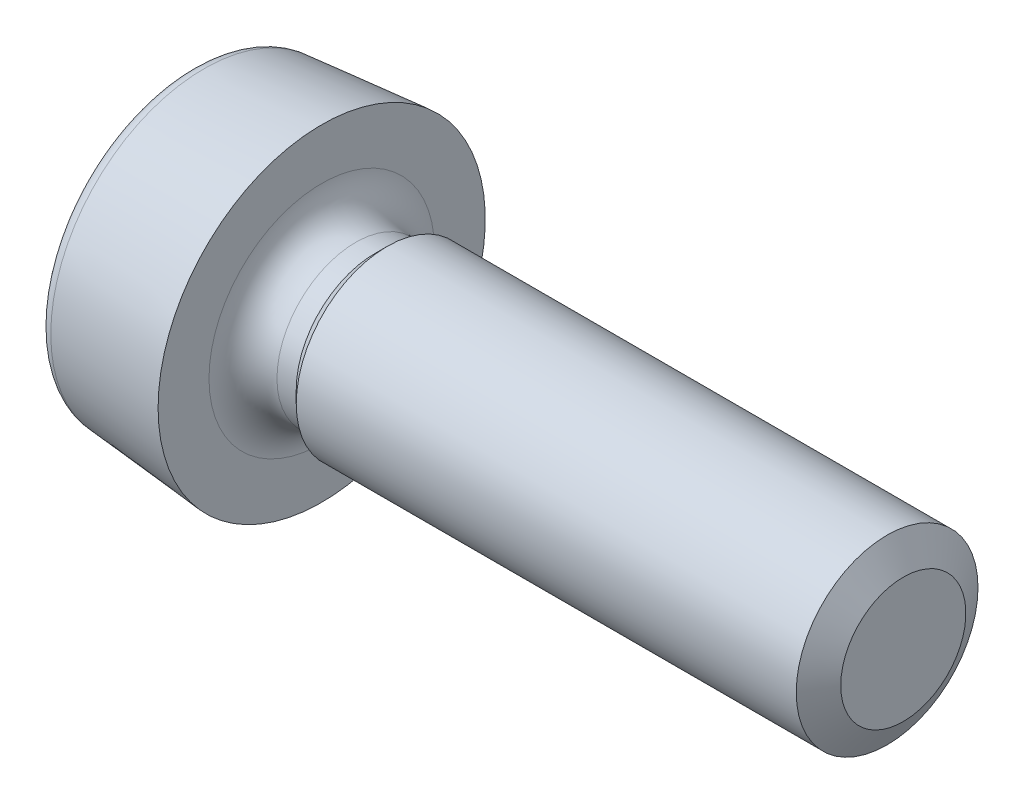
ISO-10303-21;
HEADER;
FILE_DESCRIPTION(('STEP AP214'),'2;1');
FILE_NAME('part.step','',(''),(''),'','','');
FILE_SCHEMA(('AUTOMOTIVE_DESIGN { 1 0 10303 214 1 1 1 1 }'));
ENDSEC;
DATA;
#1=APPLICATION_CONTEXT('core data for automotive mechanical design processes');
#2=APPLICATION_PROTOCOL_DEFINITION('international standard','automotive_design',2000,#1);
#3=PRODUCT_CONTEXT('',#1,'mechanical');
#4=PRODUCT('Part','Part','',(#3));
#5=PRODUCT_RELATED_PRODUCT_CATEGORY('part','',(#4));
#6=PRODUCT_DEFINITION_FORMATION('','',#4);
#7=PRODUCT_DEFINITION_CONTEXT('part definition',#1,'design');
#8=PRODUCT_DEFINITION('design','',#6,#7);
#9=PRODUCT_DEFINITION_SHAPE('','',#8);
#10=(LENGTH_UNIT() NAMED_UNIT(*) SI_UNIT(.MILLI.,.METRE.));
#11=(NAMED_UNIT(*) PLANE_ANGLE_UNIT() SI_UNIT($,.RADIAN.));
#12=(NAMED_UNIT(*) SI_UNIT($,.STERADIAN.) SOLID_ANGLE_UNIT());
#13=UNCERTAINTY_MEASURE_WITH_UNIT(LENGTH_MEASURE(1.E-05),#10,'distance_accuracy_value','');
#14=(GEOMETRIC_REPRESENTATION_CONTEXT(3) GLOBAL_UNCERTAINTY_ASSIGNED_CONTEXT((#13)) GLOBAL_UNIT_ASSIGNED_CONTEXT((#10,
#11,#12)) REPRESENTATION_CONTEXT('',''));
#15=CARTESIAN_POINT('',(0.,0.,0.));
#16=DIRECTION('',(0.,0.,1.));
#17=DIRECTION('',(1.,0.,0.));
#18=AXIS2_PLACEMENT_3D('',#15,#16,#17);
#19=CARTESIAN_POINT('',(0.,1.90925417084986,0.));
#20=DIRECTION('',(1.,0.,0.));
#21=DIRECTION('',(0.,0.,-1.));
#22=AXIS2_PLACEMENT_3D('',#19,#20,#21);
#23=PLANE('',#22);
#24=CARTESIAN_POINT('',(0.,0.,0.));
#25=DIRECTION('',(-1.,0.,0.));
#26=DIRECTION('',(0.,0.,1.));
#27=AXIS2_PLACEMENT_3D('',#24,#25,#26);
#28=CIRCLE('',#27,1.90925417084986);
#29=CARTESIAN_POINT('',(0.,0.,1.90925417084986));
#30=VERTEX_POINT('',#29);
#31=EDGE_CURVE('E171',#30,#30,#28,.T.);
#32=ORIENTED_EDGE('',*,*,#31,.T.);
#33=EDGE_LOOP('',(#32));
#34=FACE_BOUND('',#33,.T.);
#35=DIRECTION('',(0.,0.,1.));
#36=VECTOR('',#35,1.);
#37=CARTESIAN_POINT('',(0.,-0.225000000000005,1.35));
#38=LINE('',#37,#36);
#39=CARTESIAN_POINT('',(0.,-0.225000000000001,0.225));
#40=VERTEX_POINT('',#39);
#41=CARTESIAN_POINT('',(0.,-0.225000000000005,1.35));
#42=VERTEX_POINT('',#41);
#43=EDGE_CURVE('E137',#40,#42,#38,.T.);
#44=ORIENTED_EDGE('',*,*,#43,.F.);
#45=DIRECTION('',(0.,1.,0.));
#46=VECTOR('',#45,1.);
#47=CARTESIAN_POINT('',(0.,1.35,0.225));
#48=LINE('',#47,#46);
#49=CARTESIAN_POINT('',(0.,-1.35,0.225));
#50=VERTEX_POINT('',#49);
#51=EDGE_CURVE('E156',#50,#40,#48,.T.);
#52=ORIENTED_EDGE('',*,*,#51,.F.);
#53=DIRECTION('',(0.,0.,1.));
#54=VECTOR('',#53,1.);
#55=CARTESIAN_POINT('',(0.,-1.35,-0.225));
#56=LINE('',#55,#54);
#57=CARTESIAN_POINT('',(0.,-1.35,-0.225));
#58=VERTEX_POINT('',#57);
#59=EDGE_CURVE('E148',#58,#50,#56,.T.);
#60=ORIENTED_EDGE('',*,*,#59,.F.);
#61=DIRECTION('',(0.,-1.,0.));
#62=VECTOR('',#61,1.);
#63=CARTESIAN_POINT('',(0.,1.35,-0.225));
#64=LINE('',#63,#62);
#65=CARTESIAN_POINT('',(0.,-0.224999999999999,-0.225));
#66=VERTEX_POINT('',#65);
#67=EDGE_CURVE('E80',#66,#58,#64,.T.);
#68=ORIENTED_EDGE('',*,*,#67,.F.);
#69=CARTESIAN_POINT('',(0.,-0.224999999999995,-1.35));
#70=VERTEX_POINT('',#69);
#71=EDGE_CURVE('E95',#70,#66,#38,.T.);
#72=ORIENTED_EDGE('',*,*,#71,.F.);
#73=DIRECTION('',(0.,-1.,0.));
#74=VECTOR('',#73,1.);
#75=CARTESIAN_POINT('',(0.,0.225000000000005,-1.35));
#76=LINE('',#75,#74);
#77=CARTESIAN_POINT('',(0.,0.225000000000005,-1.35));
#78=VERTEX_POINT('',#77);
#79=EDGE_CURVE('E133',#78,#70,#76,.T.);
#80=ORIENTED_EDGE('',*,*,#79,.F.);
#81=DIRECTION('',(0.,0.,-1.));
#82=VECTOR('',#81,1.);
#83=CARTESIAN_POINT('',(0.,0.224999999999995,1.35));
#84=LINE('',#83,#82);
#85=CARTESIAN_POINT('',(0.,0.225000000000001,-0.225));
#86=VERTEX_POINT('',#85);
#87=EDGE_CURVE('E134',#86,#78,#84,.T.);
#88=ORIENTED_EDGE('',*,*,#87,.F.);
#89=CARTESIAN_POINT('',(0.,1.35,-0.225));
#90=VERTEX_POINT('',#89);
#91=EDGE_CURVE('E151',#90,#86,#64,.T.);
#92=ORIENTED_EDGE('',*,*,#91,.F.);
#93=DIRECTION('',(0.,0.,-1.));
#94=VECTOR('',#93,1.);
#95=CARTESIAN_POINT('',(0.,1.35,-0.225));
#96=LINE('',#95,#94);
#97=CARTESIAN_POINT('',(0.,1.35,0.225));
#98=VERTEX_POINT('',#97);
#99=EDGE_CURVE('E153',#98,#90,#96,.T.);
#100=ORIENTED_EDGE('',*,*,#99,.F.);
#101=CARTESIAN_POINT('',(0.,0.224999999999999,0.225));
#102=VERTEX_POINT('',#101);
#103=EDGE_CURVE('E65',#102,#98,#48,.T.);
#104=ORIENTED_EDGE('',*,*,#103,.F.);
#105=CARTESIAN_POINT('',(0.,0.224999999999995,1.35));
#106=VERTEX_POINT('',#105);
#107=EDGE_CURVE('E127',#106,#102,#84,.T.);
#108=ORIENTED_EDGE('',*,*,#107,.F.);
#109=DIRECTION('',(0.,1.,0.));
#110=VECTOR('',#109,1.);
#111=CARTESIAN_POINT('',(0.,0.224999999999995,1.35));
#112=LINE('',#111,#110);
#113=EDGE_CURVE('E115',#42,#106,#112,.T.);
#114=ORIENTED_EDGE('',*,*,#113,.F.);
#115=EDGE_LOOP('',(#44,#52,#60,#68,#72,#80,#88,#92,#100,#104,#108,#114));
#116=FACE_BOUND('',#115,.T.);
#117=ADVANCED_FACE('F42',(#34,#116),#23,.F.);
#118=CARTESIAN_POINT('',(1.2,0.,0.));
#119=DIRECTION('',(-0.184288535050185,0.,-0.982872186934322));
#120=DIRECTION('',(-0.982872186934322,0.,0.184288535050185));
#121=AXIS2_PLACEMENT_3D('',#118,#119,#120);
#122=PLANE('',#121);
#123=ORIENTED_EDGE('',*,*,#51,.T.);
#124=DIRECTION('',(0.966595349328283,0.181236627999054,-0.181236627999053));
#125=VECTOR('',#124,1.);
#126=CARTESIAN_POINT('',(1.2,0.,0.));
#127=LINE('',#126,#125);
#128=CARTESIAN_POINT('',(1.2,0.,0.));
#129=VERTEX_POINT('',#128);
#130=EDGE_CURVE('E87',#40,#129,#127,.T.);
#131=ORIENTED_EDGE('',*,*,#130,.T.);
#132=DIRECTION('',(0.659268514744263,0.741677079087296,-0.123612846514549));
#133=VECTOR('',#132,1.);
#134=CARTESIAN_POINT('',(0.,-1.35,0.225));
#135=LINE('',#134,#133);
#136=EDGE_CURVE('E161',#50,#129,#135,.T.);
#137=ORIENTED_EDGE('',*,*,#136,.F.);
#138=EDGE_LOOP('',(#123,#131,#137));
#139=FACE_BOUND('',#138,.T.);
#140=ADVANCED_FACE('F205',(#139),#122,.T.);
#141=DIRECTION('',(0.659268514744263,-0.741677079087296,-0.123612846514549));
#142=VECTOR('',#141,1.);
#143=CARTESIAN_POINT('',(0.,1.35,0.225));
#144=LINE('',#143,#142);
#145=EDGE_CURVE('E159',#98,#129,#144,.T.);
#146=ORIENTED_EDGE('',*,*,#145,.T.);
#147=DIRECTION('',(-0.966595349328283,0.181236627999053,0.181236627999053));
#148=VECTOR('',#147,1.);
#149=CARTESIAN_POINT('',(1.2,0.,0.));
#150=LINE('',#149,#148);
#151=EDGE_CURVE('E123',#129,#102,#150,.T.);
#152=ORIENTED_EDGE('',*,*,#151,.T.);
#153=ORIENTED_EDGE('',*,*,#103,.T.);
#154=EDGE_LOOP('',(#146,#152,#153));
#155=FACE_BOUND('',#154,.T.);
#156=ADVANCED_FACE('F198',(#155),#122,.T.);
#157=CARTESIAN_POINT('',(1.2,0.,0.));
#158=DIRECTION('',(-0.184288535050185,0.,0.982872186934322));
#159=DIRECTION('',(0.982872186934322,0.,0.184288535050185));
#160=AXIS2_PLACEMENT_3D('',#157,#158,#159);
#161=PLANE('',#160);
#162=DIRECTION('',(0.659268514744263,0.741677079087296,0.123612846514549));
#163=VECTOR('',#162,1.);
#164=CARTESIAN_POINT('',(0.,-1.35,-0.225));
#165=LINE('',#164,#163);
#166=EDGE_CURVE('E147',#58,#129,#165,.T.);
#167=ORIENTED_EDGE('',*,*,#166,.T.);
#168=DIRECTION('',(-0.966595349328283,-0.181236627999053,-0.181236627999053));
#169=VECTOR('',#168,1.);
#170=CARTESIAN_POINT('',(1.2,0.,0.));
#171=LINE('',#170,#169);
#172=EDGE_CURVE('E11',#129,#66,#171,.T.);
#173=ORIENTED_EDGE('',*,*,#172,.T.);
#174=ORIENTED_EDGE('',*,*,#67,.T.);
#175=EDGE_LOOP('',(#167,#173,#174));
#176=FACE_BOUND('',#175,.T.);
#177=ADVANCED_FACE('F199',(#176),#161,.T.);
#178=ORIENTED_EDGE('',*,*,#91,.T.);
#179=DIRECTION('',(0.966595349328283,-0.181236627999054,0.181236627999053));
#180=VECTOR('',#179,1.);
#181=CARTESIAN_POINT('',(1.2,0.,0.));
#182=LINE('',#181,#180);
#183=EDGE_CURVE('E49',#86,#129,#182,.T.);
#184=ORIENTED_EDGE('',*,*,#183,.T.);
#185=DIRECTION('',(0.659268514744263,-0.741677079087296,0.123612846514549));
#186=VECTOR('',#185,1.);
#187=CARTESIAN_POINT('',(0.,1.35,-0.225));
#188=LINE('',#187,#186);
#189=EDGE_CURVE('E56',#90,#129,#188,.T.);
#190=ORIENTED_EDGE('',*,*,#189,.F.);
#191=EDGE_LOOP('',(#178,#184,#190));
#192=FACE_BOUND('',#191,.T.);
#193=ADVANCED_FACE('F192',(#192),#161,.T.);
#194=CARTESIAN_POINT('',(-2.16958058991907,0.,0.));
#195=DIRECTION('',(-1.,0.,0.));
#196=DIRECTION('',(0.,0.,1.));
#197=AXIS2_PLACEMENT_3D('',#194,#195,#196);
#198=CYLINDRICAL_SURFACE('',#197,1.25);
#199=CARTESIAN_POINT('',(2.7,0.,0.));
#200=DIRECTION('',(-1.,0.,0.));
#201=DIRECTION('',(0.,0.,1.));
#202=AXIS2_PLACEMENT_3D('',#199,#200,#201);
#203=CIRCLE('',#202,1.25);
#204=CARTESIAN_POINT('',(2.7,0.,1.25));
#205=VERTEX_POINT('',#204);
#206=EDGE_CURVE('E190',#205,#205,#203,.T.);
#207=ORIENTED_EDGE('',*,*,#206,.F.);
#208=EDGE_LOOP('',(#207));
#209=FACE_BOUND('',#208,.T.);
#210=CARTESIAN_POINT('',(9.57743720258487,0.,0.));
#211=DIRECTION('',(-1.,0.,0.));
#212=DIRECTION('',(0.,0.,1.));
#213=AXIS2_PLACEMENT_3D('',#210,#211,#212);
#214=CIRCLE('',#213,1.25);
#215=CARTESIAN_POINT('',(9.57743720258487,0.,1.25));
#216=VERTEX_POINT('',#215);
#217=EDGE_CURVE('E168',#216,#216,#214,.T.);
#218=ORIENTED_EDGE('',*,*,#217,.T.);
#219=EDGE_LOOP('',(#218));
#220=FACE_BOUND('',#219,.T.);
#221=ADVANCED_FACE('F263',(#209,#220),#198,.T.);
#222=CARTESIAN_POINT('',(2.7,0.,0.));
#223=DIRECTION('',(1.,0.,0.));
#224=DIRECTION('',(0.,0.,-1.));
#225=AXIS2_PLACEMENT_3D('',#222,#223,#224);
#226=CONICAL_SURFACE('',#225,1.25,0.785398163397442);
#227=CARTESIAN_POINT('',(2.5325,0.,0.));
#228=DIRECTION('',(-1.,0.,0.));
#229=DIRECTION('',(0.,0.,1.));
#230=AXIS2_PLACEMENT_3D('',#227,#228,#229);
#231=CIRCLE('',#230,1.0825);
#232=CARTESIAN_POINT('',(2.5325,0.,1.0825));
#233=VERTEX_POINT('',#232);
#234=EDGE_CURVE('E187',#233,#233,#231,.T.);
#235=ORIENTED_EDGE('',*,*,#234,.F.);
#236=EDGE_LOOP('',(#235));
#237=FACE_BOUND('',#236,.T.);
#238=ORIENTED_EDGE('',*,*,#206,.T.);
#239=EDGE_LOOP('',(#238));
#240=FACE_BOUND('',#239,.T.);
#241=ADVANCED_FACE('F257',(#237,#240),#226,.T.);
#242=CARTESIAN_POINT('',(-2.16958058991907,0.,0.));
#243=DIRECTION('',(-1.,0.,0.));
#244=DIRECTION('',(0.,0.,1.));
#245=AXIS2_PLACEMENT_3D('',#242,#243,#244);
#246=CYLINDRICAL_SURFACE('',#245,1.0825);
#247=CARTESIAN_POINT('',(2.2675,0.,0.));
#248=DIRECTION('',(-1.,0.,0.));
#249=DIRECTION('',(0.,0.,1.));
#250=AXIS2_PLACEMENT_3D('',#247,#248,#249);
#251=CIRCLE('',#250,1.0825);
#252=CARTESIAN_POINT('',(2.2675,0.,1.0825));
#253=VERTEX_POINT('',#252);
#254=EDGE_CURVE('E184',#253,#253,#251,.T.);
#255=ORIENTED_EDGE('',*,*,#254,.F.);
#256=EDGE_LOOP('',(#255));
#257=FACE_BOUND('',#256,.T.);
#258=ORIENTED_EDGE('',*,*,#234,.T.);
#259=EDGE_LOOP('',(#258));
#260=FACE_BOUND('',#259,.T.);
#261=ADVANCED_FACE('F251',(#257,#260),#246,.T.);
#262=CARTESIAN_POINT('',(2.2675,0.,0.));
#263=DIRECTION('',(-1.,0.,0.));
#264=DIRECTION('',(0.,0.,1.));
#265=AXIS2_PLACEMENT_3D('',#262,#263,#264);
#266=TOROIDAL_SURFACE('',#265,1.55,0.4675);
#267=CARTESIAN_POINT('',(1.8,0.,0.));
#268=DIRECTION('',(-1.,0.,0.));
#269=DIRECTION('',(0.,0.,1.));
#270=AXIS2_PLACEMENT_3D('',#267,#268,#269);
#271=CIRCLE('',#270,1.55);
#272=CARTESIAN_POINT('',(1.8,0.,1.55));
#273=VERTEX_POINT('',#272);
#274=EDGE_CURVE('E181',#273,#273,#271,.T.);
#275=ORIENTED_EDGE('',*,*,#274,.F.);
#276=EDGE_LOOP('',(#275));
#277=FACE_BOUND('',#276,.T.);
#278=ORIENTED_EDGE('',*,*,#254,.T.);
#279=EDGE_LOOP('',(#278));
#280=FACE_BOUND('',#279,.T.);
#281=ADVANCED_FACE('F245',(#277,#280),#266,.F.);
#282=CARTESIAN_POINT('',(1.8,1.55,0.));
#283=DIRECTION('',(-1.,0.,0.));
#284=DIRECTION('',(0.,0.,1.));
#285=AXIS2_PLACEMENT_3D('',#282,#283,#284);
#286=PLANE('',#285);
#287=CARTESIAN_POINT('',(1.8,0.,0.));
#288=DIRECTION('',(-1.,0.,0.));
#289=DIRECTION('',(0.,0.,1.));
#290=AXIS2_PLACEMENT_3D('',#287,#288,#289);
#291=CIRCLE('',#290,2.25);
#292=CARTESIAN_POINT('',(1.8,0.,2.25));
#293=VERTEX_POINT('',#292);
#294=EDGE_CURVE('E177',#293,#293,#291,.T.);
#295=ORIENTED_EDGE('',*,*,#294,.F.);
#296=EDGE_LOOP('',(#295));
#297=FACE_BOUND('',#296,.T.);
#298=ORIENTED_EDGE('',*,*,#274,.T.);
#299=EDGE_LOOP('',(#298));
#300=FACE_BOUND('',#299,.T.);
#301=ADVANCED_FACE('F239',(#297,#300),#286,.F.);
#302=CARTESIAN_POINT('',(1.8,0.,0.));
#303=DIRECTION('',(1.,0.,0.));
#304=DIRECTION('',(0.,0.,-1.));
#305=AXIS2_PLACEMENT_3D('',#302,#303,#304);
#306=CONICAL_SURFACE('',#305,2.25,0.0872664625997097);
#307=CARTESIAN_POINT('',(0.18256885145047,0.,0.));
#308=DIRECTION('',(-1.,0.,0.));
#309=DIRECTION('',(0.,0.,1.));
#310=AXIS2_PLACEMENT_3D('',#307,#308,#309);
#311=CIRCLE('',#310,2.10849311046821);
#312=CARTESIAN_POINT('',(0.18256885145047,0.,2.10849311046821));
#313=VERTEX_POINT('',#312);
#314=EDGE_CURVE('E174',#313,#313,#311,.T.);
#315=ORIENTED_EDGE('',*,*,#314,.F.);
#316=EDGE_LOOP('',(#315));
#317=FACE_BOUND('',#316,.T.);
#318=ORIENTED_EDGE('',*,*,#294,.T.);
#319=EDGE_LOOP('',(#318));
#320=FACE_BOUND('',#319,.T.);
#321=ADVANCED_FACE('F233',(#317,#320),#306,.T.);
#322=CARTESIAN_POINT('',(0.2,0.,0.));
#323=DIRECTION('',(-1.,0.,0.));
#324=DIRECTION('',(0.,0.,1.));
#325=AXIS2_PLACEMENT_3D('',#322,#323,#324);
#326=TOROIDAL_SURFACE('',#325,1.90925417084986,0.2);
#327=ORIENTED_EDGE('',*,*,#31,.F.);
#328=EDGE_LOOP('',(#327));
#329=FACE_BOUND('',#328,.T.);
#330=ORIENTED_EDGE('',*,*,#314,.T.);
#331=EDGE_LOOP('',(#330));
#332=FACE_BOUND('',#331,.T.);
#333=ADVANCED_FACE('F229',(#329,#332),#326,.T.);
#334=CARTESIAN_POINT('',(9.57743720258487,0.,0.));
#335=DIRECTION('',(-1.,0.,0.));
#336=DIRECTION('',(0.,0.,1.));
#337=AXIS2_PLACEMENT_3D('',#334,#335,#336);
#338=CONICAL_SURFACE('',#337,1.25,1.05188801855281);
#339=CARTESIAN_POINT('',(9.8,0.,0.));
#340=DIRECTION('',(-1.,0.,0.));
#341=DIRECTION('',(0.,0.,1.));
#342=AXIS2_PLACEMENT_3D('',#339,#340,#341);
#343=CIRCLE('',#342,0.860299999999999);
#344=CARTESIAN_POINT('',(9.8,0.,0.860299999999999));
#345=VERTEX_POINT('',#344);
#346=EDGE_CURVE('E155',#345,#345,#343,.T.);
#347=ORIENTED_EDGE('',*,*,#346,.T.);
#348=EDGE_LOOP('',(#347));
#349=FACE_BOUND('',#348,.T.);
#350=ORIENTED_EDGE('',*,*,#217,.F.);
#351=EDGE_LOOP('',(#350));
#352=FACE_BOUND('',#351,.T.);
#353=ADVANCED_FACE('F232',(#349,#352),#338,.T.);
#354=CARTESIAN_POINT('',(9.8,0.,0.));
#355=DIRECTION('',(-1.,0.,0.));
#356=DIRECTION('',(0.,0.,1.));
#357=AXIS2_PLACEMENT_3D('',#354,#355,#356);
#358=PLANE('',#357);
#359=ORIENTED_EDGE('',*,*,#346,.F.);
#360=EDGE_LOOP('',(#359));
#361=FACE_BOUND('',#360,.T.);
#362=ADVANCED_FACE('F273',(#361),#358,.F.);
#363=CARTESIAN_POINT('',(0.,1.35,0.225));
#364=DIRECTION('',(0.74740931868366,0.66436383882992,0.));
#365=DIRECTION('',(-0.66436383882992,0.74740931868366,0.));
#366=AXIS2_PLACEMENT_3D('',#363,#364,#365);
#367=PLANE('',#366);
#368=ORIENTED_EDGE('',*,*,#145,.F.);
#369=ORIENTED_EDGE('',*,*,#99,.T.);
#370=ORIENTED_EDGE('',*,*,#189,.T.);
#371=EDGE_LOOP('',(#368,#369,#370));
#372=FACE_BOUND('',#371,.T.);
#373=ADVANCED_FACE('F197',(#372),#367,.F.);
#374=CARTESIAN_POINT('',(0.,-1.35,-0.225));
#375=DIRECTION('',(0.74740931868366,-0.66436383882992,0.));
#376=DIRECTION('',(0.66436383882992,0.74740931868366,0.));
#377=AXIS2_PLACEMENT_3D('',#374,#375,#376);
#378=PLANE('',#377);
#379=ORIENTED_EDGE('',*,*,#166,.F.);
#380=ORIENTED_EDGE('',*,*,#59,.T.);
#381=ORIENTED_EDGE('',*,*,#136,.T.);
#382=EDGE_LOOP('',(#379,#380,#381));
#383=FACE_BOUND('',#382,.T.);
#384=ADVANCED_FACE('F202',(#383),#378,.F.);
#385=CARTESIAN_POINT('',(1.2,0.,0.));
#386=DIRECTION('',(-0.184288535050185,0.982872186934322,0.));
#387=DIRECTION('',(-0.982872186934322,-0.184288535050185,0.));
#388=AXIS2_PLACEMENT_3D('',#385,#386,#387);
#389=PLANE('',#388);
#390=DIRECTION('',(0.659268514744263,0.123612846514547,0.741677079087297));
#391=VECTOR('',#390,1.);
#392=CARTESIAN_POINT('',(0.,-0.224999999999995,-1.35));
#393=LINE('',#392,#391);
#394=EDGE_CURVE('E129',#70,#129,#393,.T.);
#395=ORIENTED_EDGE('',*,*,#394,.F.);
#396=ORIENTED_EDGE('',*,*,#71,.T.);
#397=ORIENTED_EDGE('',*,*,#172,.F.);
#398=EDGE_LOOP('',(#395,#396,#397));
#399=FACE_BOUND('',#398,.T.);
#400=ADVANCED_FACE('F210',(#399),#389,.T.);
#401=CARTESIAN_POINT('',(1.2,0.,0.));
#402=DIRECTION('',(-0.184288535050185,-0.982872186934322,0.));
#403=DIRECTION('',(0.982872186934322,-0.184288535050185,0.));
#404=AXIS2_PLACEMENT_3D('',#401,#402,#403);
#405=PLANE('',#404);
#406=ORIENTED_EDGE('',*,*,#87,.T.);
#407=DIRECTION('',(0.659268514744263,-0.123612846514552,0.741677079087296));
#408=VECTOR('',#407,1.);
#409=CARTESIAN_POINT('',(0.,0.225000000000005,-1.35));
#410=LINE('',#409,#408);
#411=EDGE_CURVE('E130',#78,#129,#410,.T.);
#412=ORIENTED_EDGE('',*,*,#411,.T.);
#413=ORIENTED_EDGE('',*,*,#183,.F.);
#414=EDGE_LOOP('',(#406,#412,#413));
#415=FACE_BOUND('',#414,.T.);
#416=ADVANCED_FACE('F216',(#415),#405,.T.);
#417=CARTESIAN_POINT('',(0.,0.225000000000005,-1.35));
#418=DIRECTION('',(0.74740931868366,0.,-0.66436383882992));
#419=DIRECTION('',(0.66436383882992,0.,0.74740931868366));
#420=AXIS2_PLACEMENT_3D('',#417,#418,#419);
#421=PLANE('',#420);
#422=ORIENTED_EDGE('',*,*,#411,.F.);
#423=ORIENTED_EDGE('',*,*,#79,.T.);
#424=ORIENTED_EDGE('',*,*,#394,.T.);
#425=EDGE_LOOP('',(#422,#423,#424));
#426=FACE_BOUND('',#425,.T.);
#427=ADVANCED_FACE('F208',(#426),#421,.F.);
#428=ORIENTED_EDGE('',*,*,#43,.T.);
#429=DIRECTION('',(0.659268514744263,0.123612846514552,-0.741677079087296));
#430=VECTOR('',#429,1.);
#431=CARTESIAN_POINT('',(0.,-0.225000000000005,1.35));
#432=LINE('',#431,#430);
#433=EDGE_CURVE('E120',#42,#129,#432,.T.);
#434=ORIENTED_EDGE('',*,*,#433,.T.);
#435=ORIENTED_EDGE('',*,*,#130,.F.);
#436=EDGE_LOOP('',(#428,#434,#435));
#437=FACE_BOUND('',#436,.T.);
#438=ADVANCED_FACE('F206',(#437),#389,.T.);
#439=DIRECTION('',(0.659268514744263,-0.123612846514547,-0.741677079087297));
#440=VECTOR('',#439,1.);
#441=CARTESIAN_POINT('',(0.,0.224999999999995,1.35));
#442=LINE('',#441,#440);
#443=EDGE_CURVE('E118',#106,#129,#442,.T.);
#444=ORIENTED_EDGE('',*,*,#443,.F.);
#445=ORIENTED_EDGE('',*,*,#107,.T.);
#446=ORIENTED_EDGE('',*,*,#151,.F.);
#447=EDGE_LOOP('',(#444,#445,#446));
#448=FACE_BOUND('',#447,.T.);
#449=ADVANCED_FACE('F126',(#448),#405,.T.);
#450=CARTESIAN_POINT('',(0.,-0.225000000000005,1.35));
#451=DIRECTION('',(0.74740931868366,0.,0.66436383882992));
#452=DIRECTION('',(-0.66436383882992,0.,0.74740931868366));
#453=AXIS2_PLACEMENT_3D('',#450,#451,#452);
#454=PLANE('',#453);
#455=ORIENTED_EDGE('',*,*,#433,.F.);
#456=ORIENTED_EDGE('',*,*,#113,.T.);
#457=ORIENTED_EDGE('',*,*,#443,.T.);
#458=EDGE_LOOP('',(#455,#456,#457));
#459=FACE_BOUND('',#458,.T.);
#460=ADVANCED_FACE('F117',(#459),#454,.F.);
#461=CLOSED_SHELL('',(#117,#140,#156,#177,#193,#221,#241,#261,#281,#301,#321,#333,#353,#362,
#373,#384,#400,#416,#427,#438,#449,#460));
#462=MANIFOLD_SOLID_BREP('B2',#461);
#463=ADVANCED_BREP_SHAPE_REPRESENTATION('',(#18,#462),#14);
#464=SHAPE_DEFINITION_REPRESENTATION(#9,#463);
ENDSEC;
END-ISO-10303-21;
